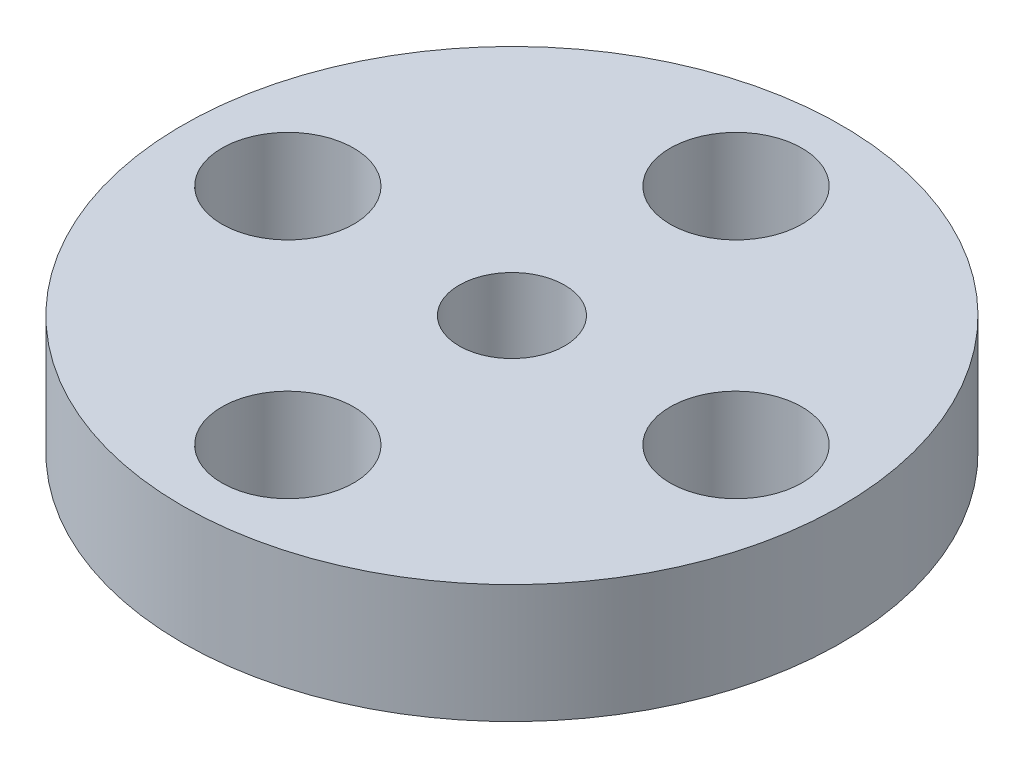
ISO-10303-21;
HEADER;
FILE_DESCRIPTION(('STEP AP214'),'2;1');
FILE_NAME('part.step','',(''),(''),'','','');
FILE_SCHEMA(('AUTOMOTIVE_DESIGN { 1 0 10303 214 1 1 1 1 }'));
ENDSEC;
DATA;
#1=APPLICATION_CONTEXT('core data for automotive mechanical design processes');
#2=APPLICATION_PROTOCOL_DEFINITION('international standard','automotive_design',2000,#1);
#3=PRODUCT_CONTEXT('',#1,'mechanical');
#4=PRODUCT('Part','Part','',(#3));
#5=PRODUCT_RELATED_PRODUCT_CATEGORY('part','',(#4));
#6=PRODUCT_DEFINITION_FORMATION('','',#4);
#7=PRODUCT_DEFINITION_CONTEXT('part definition',#1,'design');
#8=PRODUCT_DEFINITION('design','',#6,#7);
#9=PRODUCT_DEFINITION_SHAPE('','',#8);
#10=(LENGTH_UNIT() NAMED_UNIT(*) SI_UNIT(.MILLI.,.METRE.));
#11=(NAMED_UNIT(*) PLANE_ANGLE_UNIT() SI_UNIT($,.RADIAN.));
#12=(NAMED_UNIT(*) SI_UNIT($,.STERADIAN.) SOLID_ANGLE_UNIT());
#13=UNCERTAINTY_MEASURE_WITH_UNIT(LENGTH_MEASURE(1.E-05),#10,'distance_accuracy_value','');
#14=(GEOMETRIC_REPRESENTATION_CONTEXT(3) GLOBAL_UNCERTAINTY_ASSIGNED_CONTEXT((#13)) GLOBAL_UNIT_ASSIGNED_CONTEXT((#10,
#11,#12)) REPRESENTATION_CONTEXT('',''));
#15=CARTESIAN_POINT('',(0.,0.,0.));
#16=DIRECTION('',(0.,0.,1.));
#17=DIRECTION('',(1.,0.,0.));
#18=AXIS2_PLACEMENT_3D('',#15,#16,#17);
#19=CARTESIAN_POINT('',(0.,9.,0.));
#20=DIRECTION('',(0.,1.,0.));
#21=DIRECTION('',(0.,0.,1.));
#22=AXIS2_PLACEMENT_3D('',#19,#20,#21);
#23=PLANE('',#22);
#24=CARTESIAN_POINT('',(-1.94393537707973E-13,9.,17.));
#25=DIRECTION('',(0.,1.,0.));
#26=DIRECTION('',(0.,0.,1.));
#27=AXIS2_PLACEMENT_3D('',#24,#25,#26);
#28=CIRCLE('',#27,5.);
#29=CARTESIAN_POINT('',(-1.94393537707973E-13,9.,22.));
#30=VERTEX_POINT('',#29);
#31=EDGE_CURVE('E89',#30,#30,#28,.T.);
#32=ORIENTED_EDGE('',*,*,#31,.F.);
#33=EDGE_LOOP('',(#32));
#34=FACE_BOUND('',#33,.T.);
#35=CARTESIAN_POINT('',(0.,9.,-17.));
#36=DIRECTION('',(0.,1.,0.));
#37=DIRECTION('',(0.,0.,1.));
#38=AXIS2_PLACEMENT_3D('',#35,#36,#37);
#39=CIRCLE('',#38,5.);
#40=CARTESIAN_POINT('',(0.,9.,-12.));
#41=VERTEX_POINT('',#40);
#42=EDGE_CURVE('E76',#41,#41,#39,.T.);
#43=ORIENTED_EDGE('',*,*,#42,.F.);
#44=EDGE_LOOP('',(#43));
#45=FACE_BOUND('',#44,.T.);
#46=CARTESIAN_POINT('',(0.,9.,0.));
#47=DIRECTION('',(0.,1.,0.));
#48=DIRECTION('',(0.,0.,1.));
#49=AXIS2_PLACEMENT_3D('',#46,#47,#48);
#50=CIRCLE('',#49,25.);
#51=CARTESIAN_POINT('',(0.,9.,25.));
#52=VERTEX_POINT('',#51);
#53=EDGE_CURVE('E60',#52,#52,#50,.T.);
#54=ORIENTED_EDGE('',*,*,#53,.T.);
#55=EDGE_LOOP('',(#54));
#56=FACE_BOUND('',#55,.T.);
#57=CARTESIAN_POINT('',(0.,9.,0.));
#58=DIRECTION('',(0.,1.,0.));
#59=DIRECTION('',(0.,0.,1.));
#60=AXIS2_PLACEMENT_3D('',#57,#58,#59);
#61=CIRCLE('',#60,4.);
#62=CARTESIAN_POINT('',(0.,9.,4.));
#63=VERTEX_POINT('',#62);
#64=EDGE_CURVE('E71',#63,#63,#61,.T.);
#65=ORIENTED_EDGE('',*,*,#64,.F.);
#66=EDGE_LOOP('',(#65));
#67=FACE_BOUND('',#66,.T.);
#68=CARTESIAN_POINT('',(17.,9.,1.3503835494764E-13));
#69=DIRECTION('',(0.,1.,0.));
#70=DIRECTION('',(0.,0.,1.));
#71=AXIS2_PLACEMENT_3D('',#68,#69,#70);
#72=CIRCLE('',#71,5.);
#73=CARTESIAN_POINT('',(17.,9.,5.00000000000014));
#74=VERTEX_POINT('',#73);
#75=EDGE_CURVE('E81',#74,#74,#72,.T.);
#76=ORIENTED_EDGE('',*,*,#75,.F.);
#77=EDGE_LOOP('',(#76));
#78=FACE_BOUND('',#77,.T.);
#79=CARTESIAN_POINT('',(-17.,9.,-2.53748720468306E-13));
#80=DIRECTION('',(0.,1.,0.));
#81=DIRECTION('',(0.,0.,1.));
#82=AXIS2_PLACEMENT_3D('',#79,#80,#81);
#83=CIRCLE('',#82,5.);
#84=CARTESIAN_POINT('',(-17.,9.,4.99999999999975));
#85=VERTEX_POINT('',#84);
#86=EDGE_CURVE('E97',#85,#85,#83,.T.);
#87=ORIENTED_EDGE('',*,*,#86,.F.);
#88=EDGE_LOOP('',(#87));
#89=FACE_BOUND('',#88,.T.);
#90=ADVANCED_FACE('F52',(#34,#45,#56,#67,#78,#89),#23,.T.);
#91=CARTESIAN_POINT('',(0.,0.,0.));
#92=DIRECTION('',(0.,1.,0.));
#93=DIRECTION('',(0.,0.,1.));
#94=AXIS2_PLACEMENT_3D('',#91,#92,#93);
#95=PLANE('',#94);
#96=CARTESIAN_POINT('',(0.,0.,0.));
#97=DIRECTION('',(0.,1.,0.));
#98=DIRECTION('',(0.,0.,1.));
#99=AXIS2_PLACEMENT_3D('',#96,#97,#98);
#100=CIRCLE('',#99,6.);
#101=CARTESIAN_POINT('',(0.,0.,6.));
#102=VERTEX_POINT('',#101);
#103=EDGE_CURVE('E10',#102,#102,#100,.F.);
#104=ORIENTED_EDGE('',*,*,#103,.F.);
#105=EDGE_LOOP('',(#104));
#106=FACE_BOUND('',#105,.T.);
#107=CARTESIAN_POINT('',(0.,0.,0.));
#108=DIRECTION('',(0.,1.,0.));
#109=DIRECTION('',(0.,0.,1.));
#110=AXIS2_PLACEMENT_3D('',#107,#108,#109);
#111=CIRCLE('',#110,25.);
#112=CARTESIAN_POINT('',(0.,0.,25.));
#113=VERTEX_POINT('',#112);
#114=EDGE_CURVE('E65',#113,#113,#111,.T.);
#115=ORIENTED_EDGE('',*,*,#114,.F.);
#116=EDGE_LOOP('',(#115));
#117=FACE_BOUND('',#116,.T.);
#118=CARTESIAN_POINT('',(0.,0.,-17.));
#119=DIRECTION('',(0.,1.,0.));
#120=DIRECTION('',(0.,0.,1.));
#121=AXIS2_PLACEMENT_3D('',#118,#119,#120);
#122=CIRCLE('',#121,5.);
#123=CARTESIAN_POINT('',(0.,0.,-12.));
#124=VERTEX_POINT('',#123);
#125=EDGE_CURVE('E77',#124,#124,#122,.T.);
#126=ORIENTED_EDGE('',*,*,#125,.T.);
#127=EDGE_LOOP('',(#126));
#128=FACE_BOUND('',#127,.T.);
#129=CARTESIAN_POINT('',(17.,0.,1.3503835494764E-13));
#130=DIRECTION('',(0.,1.,0.));
#131=DIRECTION('',(0.,0.,1.));
#132=AXIS2_PLACEMENT_3D('',#129,#130,#131);
#133=CIRCLE('',#132,5.);
#134=CARTESIAN_POINT('',(17.,0.,5.00000000000014));
#135=VERTEX_POINT('',#134);
#136=EDGE_CURVE('E85',#135,#135,#133,.T.);
#137=ORIENTED_EDGE('',*,*,#136,.T.);
#138=EDGE_LOOP('',(#137));
#139=FACE_BOUND('',#138,.T.);
#140=CARTESIAN_POINT('',(-1.94393537707973E-13,0.,17.));
#141=DIRECTION('',(0.,1.,0.));
#142=DIRECTION('',(0.,0.,1.));
#143=AXIS2_PLACEMENT_3D('',#140,#141,#142);
#144=CIRCLE('',#143,5.);
#145=CARTESIAN_POINT('',(-1.94393537707973E-13,0.,22.));
#146=VERTEX_POINT('',#145);
#147=EDGE_CURVE('E93',#146,#146,#144,.T.);
#148=ORIENTED_EDGE('',*,*,#147,.T.);
#149=EDGE_LOOP('',(#148));
#150=FACE_BOUND('',#149,.T.);
#151=CARTESIAN_POINT('',(-17.,0.,-2.53748720468306E-13));
#152=DIRECTION('',(0.,1.,0.));
#153=DIRECTION('',(0.,0.,1.));
#154=AXIS2_PLACEMENT_3D('',#151,#152,#153);
#155=CIRCLE('',#154,5.);
#156=CARTESIAN_POINT('',(-17.,0.,4.99999999999975));
#157=VERTEX_POINT('',#156);
#158=EDGE_CURVE('E101',#157,#157,#155,.T.);
#159=ORIENTED_EDGE('',*,*,#158,.T.);
#160=EDGE_LOOP('',(#159));
#161=FACE_BOUND('',#160,.T.);
#162=ADVANCED_FACE('F132',(#106,#117,#128,#139,#150,#161),#95,.F.);
#163=CARTESIAN_POINT('',(0.,9.,0.));
#164=DIRECTION('',(0.,-1.,0.));
#165=DIRECTION('',(0.,0.,-1.));
#166=AXIS2_PLACEMENT_3D('',#163,#164,#165);
#167=CYLINDRICAL_SURFACE('',#166,25.);
#168=ORIENTED_EDGE('',*,*,#53,.F.);
#169=EDGE_LOOP('',(#168));
#170=FACE_BOUND('',#169,.T.);
#171=ORIENTED_EDGE('',*,*,#114,.T.);
#172=EDGE_LOOP('',(#171));
#173=FACE_BOUND('',#172,.T.);
#174=ADVANCED_FACE('F54',(#170,#173),#167,.T.);
#175=CARTESIAN_POINT('',(0.,9.,0.));
#176=DIRECTION('',(0.,-1.,0.));
#177=DIRECTION('',(0.,0.,-1.));
#178=AXIS2_PLACEMENT_3D('',#175,#176,#177);
#179=CYLINDRICAL_SURFACE('',#178,4.);
#180=ORIENTED_EDGE('',*,*,#64,.T.);
#181=EDGE_LOOP('',(#180));
#182=FACE_BOUND('',#181,.T.);
#183=CARTESIAN_POINT('',(0.,-1.,0.));
#184=DIRECTION('',(0.,-1.,0.));
#185=DIRECTION('',(0.,0.,-1.));
#186=AXIS2_PLACEMENT_3D('',#183,#184,#185);
#187=CIRCLE('',#186,4.);
#188=CARTESIAN_POINT('',(0.,-1.,-4.));
#189=VERTEX_POINT('',#188);
#190=EDGE_CURVE('E112',#189,#189,#187,.F.);
#191=ORIENTED_EDGE('',*,*,#190,.F.);
#192=EDGE_LOOP('',(#191));
#193=FACE_BOUND('',#192,.T.);
#194=ADVANCED_FACE('F120',(#182,#193),#179,.F.);
#195=CARTESIAN_POINT('',(0.,9.,-17.));
#196=DIRECTION('',(0.,-1.,0.));
#197=DIRECTION('',(0.,0.,-1.));
#198=AXIS2_PLACEMENT_3D('',#195,#196,#197);
#199=CYLINDRICAL_SURFACE('',#198,5.);
#200=ORIENTED_EDGE('',*,*,#42,.T.);
#201=EDGE_LOOP('',(#200));
#202=FACE_BOUND('',#201,.T.);
#203=ORIENTED_EDGE('',*,*,#125,.F.);
#204=EDGE_LOOP('',(#203));
#205=FACE_BOUND('',#204,.T.);
#206=ADVANCED_FACE('F122',(#202,#205),#199,.F.);
#207=CARTESIAN_POINT('',(17.,9.,1.3503835494764E-13));
#208=DIRECTION('',(0.,-1.,0.));
#209=DIRECTION('',(0.,0.,-1.));
#210=AXIS2_PLACEMENT_3D('',#207,#208,#209);
#211=CYLINDRICAL_SURFACE('',#210,5.);
#212=ORIENTED_EDGE('',*,*,#75,.T.);
#213=EDGE_LOOP('',(#212));
#214=FACE_BOUND('',#213,.T.);
#215=ORIENTED_EDGE('',*,*,#136,.F.);
#216=EDGE_LOOP('',(#215));
#217=FACE_BOUND('',#216,.T.);
#218=ADVANCED_FACE('F129',(#214,#217),#211,.F.);
#219=CARTESIAN_POINT('',(-1.94393537707973E-13,9.,17.));
#220=DIRECTION('',(0.,-1.,0.));
#221=DIRECTION('',(0.,0.,-1.));
#222=AXIS2_PLACEMENT_3D('',#219,#220,#221);
#223=CYLINDRICAL_SURFACE('',#222,5.);
#224=ORIENTED_EDGE('',*,*,#31,.T.);
#225=EDGE_LOOP('',(#224));
#226=FACE_BOUND('',#225,.T.);
#227=ORIENTED_EDGE('',*,*,#147,.F.);
#228=EDGE_LOOP('',(#227));
#229=FACE_BOUND('',#228,.T.);
#230=ADVANCED_FACE('F155',(#226,#229),#223,.F.);
#231=CARTESIAN_POINT('',(-17.,9.,-2.53748720468306E-13));
#232=DIRECTION('',(0.,-1.,0.));
#233=DIRECTION('',(0.,0.,-1.));
#234=AXIS2_PLACEMENT_3D('',#231,#232,#233);
#235=CYLINDRICAL_SURFACE('',#234,5.);
#236=ORIENTED_EDGE('',*,*,#86,.T.);
#237=EDGE_LOOP('',(#236));
#238=FACE_BOUND('',#237,.T.);
#239=ORIENTED_EDGE('',*,*,#158,.F.);
#240=EDGE_LOOP('',(#239));
#241=FACE_BOUND('',#240,.T.);
#242=ADVANCED_FACE('F151',(#238,#241),#235,.F.);
#243=CARTESIAN_POINT('',(0.,-1.,0.));
#244=DIRECTION('',(0.,1.,0.));
#245=DIRECTION('',(0.,0.,1.));
#246=AXIS2_PLACEMENT_3D('',#243,#244,#245);
#247=CYLINDRICAL_SURFACE('',#246,6.);
#248=CARTESIAN_POINT('',(0.,-1.,0.));
#249=DIRECTION('',(0.,-1.,0.));
#250=DIRECTION('',(0.,0.,-1.));
#251=AXIS2_PLACEMENT_3D('',#248,#249,#250);
#252=CIRCLE('',#251,6.);
#253=CARTESIAN_POINT('',(0.,-1.,-6.));
#254=VERTEX_POINT('',#253);
#255=EDGE_CURVE('E105',#254,#254,#252,.T.);
#256=ORIENTED_EDGE('',*,*,#255,.F.);
#257=EDGE_LOOP('',(#256));
#258=FACE_BOUND('',#257,.T.);
#259=ORIENTED_EDGE('',*,*,#103,.T.);
#260=EDGE_LOOP('',(#259));
#261=FACE_BOUND('',#260,.T.);
#262=ADVANCED_FACE('F154',(#258,#261),#247,.T.);
#263=CARTESIAN_POINT('',(0.,-1.,0.));
#264=DIRECTION('',(0.,-1.,0.));
#265=DIRECTION('',(0.,0.,-1.));
#266=AXIS2_PLACEMENT_3D('',#263,#264,#265);
#267=PLANE('',#266);
#268=ORIENTED_EDGE('',*,*,#190,.T.);
#269=EDGE_LOOP('',(#268));
#270=FACE_BOUND('',#269,.T.);
#271=ORIENTED_EDGE('',*,*,#255,.T.);
#272=EDGE_LOOP('',(#271));
#273=FACE_BOUND('',#272,.T.);
#274=ADVANCED_FACE('F117',(#270,#273),#267,.T.);
#275=CLOSED_SHELL('',(#90,#162,#174,#194,#206,#218,#230,#242,#262,#274));
#276=MANIFOLD_SOLID_BREP('B2',#275);
#277=ADVANCED_BREP_SHAPE_REPRESENTATION('',(#18,#276),#14);
#278=SHAPE_DEFINITION_REPRESENTATION(#9,#277);
ENDSEC;
END-ISO-10303-21;
